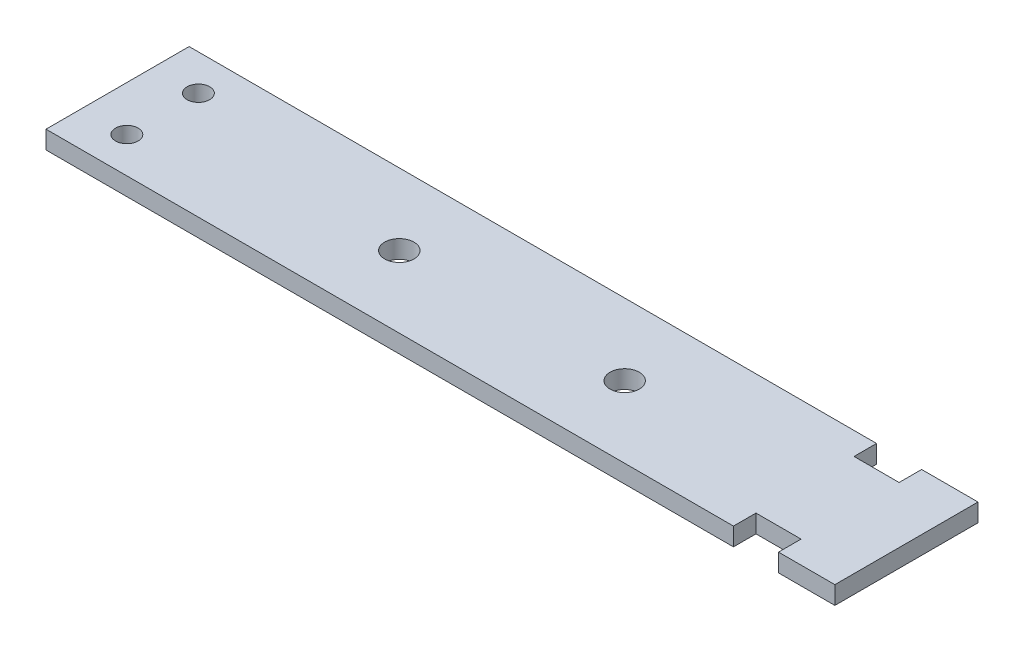
ISO-10303-21;
HEADER;
FILE_DESCRIPTION(('STEP AP214'),'2;1');
FILE_NAME('part.step','',(''),(''),'','','');
FILE_SCHEMA(('AUTOMOTIVE_DESIGN { 1 0 10303 214 1 1 1 1 }'));
ENDSEC;
DATA;
#1=APPLICATION_CONTEXT('core data for automotive mechanical design processes');
#2=APPLICATION_PROTOCOL_DEFINITION('international standard','automotive_design',2000,#1);
#3=PRODUCT_CONTEXT('',#1,'mechanical');
#4=PRODUCT('Part','Part','',(#3));
#5=PRODUCT_RELATED_PRODUCT_CATEGORY('part','',(#4));
#6=PRODUCT_DEFINITION_FORMATION('','',#4);
#7=PRODUCT_DEFINITION_CONTEXT('part definition',#1,'design');
#8=PRODUCT_DEFINITION('design','',#6,#7);
#9=PRODUCT_DEFINITION_SHAPE('','',#8);
#10=(LENGTH_UNIT() NAMED_UNIT(*) SI_UNIT(.MILLI.,.METRE.));
#11=(NAMED_UNIT(*) PLANE_ANGLE_UNIT() SI_UNIT($,.RADIAN.));
#12=(NAMED_UNIT(*) SI_UNIT($,.STERADIAN.) SOLID_ANGLE_UNIT());
#13=UNCERTAINTY_MEASURE_WITH_UNIT(LENGTH_MEASURE(1.E-05),#10,'distance_accuracy_value','');
#14=(GEOMETRIC_REPRESENTATION_CONTEXT(3) GLOBAL_UNCERTAINTY_ASSIGNED_CONTEXT((#13)) GLOBAL_UNIT_ASSIGNED_CONTEXT((#10,
#11,#12)) REPRESENTATION_CONTEXT('',''));
#15=CARTESIAN_POINT('',(0.,0.,0.));
#16=DIRECTION('',(0.,0.,1.));
#17=DIRECTION('',(1.,0.,0.));
#18=AXIS2_PLACEMENT_3D('',#15,#16,#17);
#19=CARTESIAN_POINT('',(0.,1.6,0.));
#20=DIRECTION('',(0.,-1.,0.));
#21=DIRECTION('',(0.,0.,-1.));
#22=AXIS2_PLACEMENT_3D('',#19,#20,#21);
#23=PLANE('',#22);
#24=DIRECTION('',(0.,0.,1.));
#25=VECTOR('',#24,1.);
#26=CARTESIAN_POINT('',(0.,1.6,0.));
#27=LINE('',#26,#25);
#28=CARTESIAN_POINT('',(0.,1.6,-12.7));
#29=VERTEX_POINT('',#28);
#30=CARTESIAN_POINT('',(0.,1.6,0.));
#31=VERTEX_POINT('',#30);
#32=EDGE_CURVE('E202',#29,#31,#27,.T.);
#33=ORIENTED_EDGE('',*,*,#32,.T.);
#34=DIRECTION('',(1.,0.,0.));
#35=VECTOR('',#34,1.);
#36=CARTESIAN_POINT('',(0.,1.6,0.));
#37=LINE('',#36,#35);
#38=CARTESIAN_POINT('',(61.,1.6,0.));
#39=VERTEX_POINT('',#38);
#40=EDGE_CURVE('E114',#31,#39,#37,.T.);
#41=ORIENTED_EDGE('',*,*,#40,.T.);
#42=DIRECTION('',(0.,0.,-1.));
#43=VECTOR('',#42,1.);
#44=CARTESIAN_POINT('',(61.,1.6,0.));
#45=LINE('',#44,#43);
#46=CARTESIAN_POINT('',(61.,1.6,-2.));
#47=VERTEX_POINT('',#46);
#48=EDGE_CURVE('E239',#39,#47,#45,.T.);
#49=ORIENTED_EDGE('',*,*,#48,.T.);
#50=DIRECTION('',(1.,0.,0.));
#51=VECTOR('',#50,1.);
#52=CARTESIAN_POINT('',(61.,1.6,-2.));
#53=LINE('',#52,#51);
#54=CARTESIAN_POINT('',(65.,1.6,-2.));
#55=VERTEX_POINT('',#54);
#56=EDGE_CURVE('E259',#47,#55,#53,.T.);
#57=ORIENTED_EDGE('',*,*,#56,.T.);
#58=DIRECTION('',(0.,0.,1.));
#59=VECTOR('',#58,1.);
#60=CARTESIAN_POINT('',(65.,1.6,-2.));
#61=LINE('',#60,#59);
#62=CARTESIAN_POINT('',(65.,1.6,0.));
#63=VERTEX_POINT('',#62);
#64=EDGE_CURVE('E255',#55,#63,#61,.T.);
#65=ORIENTED_EDGE('',*,*,#64,.T.);
#66=DIRECTION('',(1.,0.,0.));
#67=VECTOR('',#66,1.);
#68=CARTESIAN_POINT('',(65.,1.6,0.));
#69=LINE('',#68,#67);
#70=CARTESIAN_POINT('',(70.,1.6,0.));
#71=VERTEX_POINT('',#70);
#72=EDGE_CURVE('E258',#63,#71,#69,.T.);
#73=ORIENTED_EDGE('',*,*,#72,.T.);
#74=DIRECTION('',(0.,0.,-1.));
#75=VECTOR('',#74,1.);
#76=CARTESIAN_POINT('',(70.,1.6,0.));
#77=LINE('',#76,#75);
#78=CARTESIAN_POINT('',(70.,1.6,-12.7));
#79=VERTEX_POINT('',#78);
#80=EDGE_CURVE('E263',#71,#79,#77,.T.);
#81=ORIENTED_EDGE('',*,*,#80,.T.);
#82=DIRECTION('',(-1.,0.,0.));
#83=VECTOR('',#82,1.);
#84=CARTESIAN_POINT('',(65.,1.6,-12.7));
#85=LINE('',#84,#83);
#86=CARTESIAN_POINT('',(65.,1.6,-12.7));
#87=VERTEX_POINT('',#86);
#88=EDGE_CURVE('E270',#79,#87,#85,.T.);
#89=ORIENTED_EDGE('',*,*,#88,.T.);
#90=DIRECTION('',(0.,0.,1.));
#91=VECTOR('',#90,1.);
#92=CARTESIAN_POINT('',(65.,1.6,-12.7));
#93=LINE('',#92,#91);
#94=CARTESIAN_POINT('',(65.,1.6,-10.7));
#95=VERTEX_POINT('',#94);
#96=EDGE_CURVE('E145',#87,#95,#93,.T.);
#97=ORIENTED_EDGE('',*,*,#96,.T.);
#98=DIRECTION('',(-1.,0.,0.));
#99=VECTOR('',#98,1.);
#100=CARTESIAN_POINT('',(65.,1.6,-10.7));
#101=LINE('',#100,#99);
#102=CARTESIAN_POINT('',(61.,1.6,-10.7));
#103=VERTEX_POINT('',#102);
#104=EDGE_CURVE('E139',#95,#103,#101,.T.);
#105=ORIENTED_EDGE('',*,*,#104,.T.);
#106=DIRECTION('',(0.,0.,-1.));
#107=VECTOR('',#106,1.);
#108=CARTESIAN_POINT('',(61.,1.6,-10.7));
#109=LINE('',#108,#107);
#110=CARTESIAN_POINT('',(61.,1.6,-12.7));
#111=VERTEX_POINT('',#110);
#112=EDGE_CURVE('E143',#103,#111,#109,.T.);
#113=ORIENTED_EDGE('',*,*,#112,.T.);
#114=DIRECTION('',(-1.,0.,0.));
#115=VECTOR('',#114,1.);
#116=CARTESIAN_POINT('',(0.,1.6,-12.7));
#117=LINE('',#116,#115);
#118=EDGE_CURVE('E59',#111,#29,#117,.T.);
#119=ORIENTED_EDGE('',*,*,#118,.T.);
#120=EDGE_LOOP('',(#33,#41,#49,#57,#65,#73,#81,#89,#97,#105,#113,#119));
#121=FACE_BOUND('',#120,.T.);
#122=CARTESIAN_POINT('',(4.,1.6,-9.525));
#123=DIRECTION('',(0.,1.,0.));
#124=DIRECTION('',(0.,0.,1.));
#125=AXIS2_PLACEMENT_3D('',#122,#123,#124);
#126=CIRCLE('',#125,1.);
#127=CARTESIAN_POINT('',(4.,1.6,-8.525));
#128=VERTEX_POINT('',#127);
#129=EDGE_CURVE('E172',#128,#128,#126,.T.);
#130=ORIENTED_EDGE('',*,*,#129,.F.);
#131=EDGE_LOOP('',(#130));
#132=FACE_BOUND('',#131,.T.);
#133=CARTESIAN_POINT('',(4.,1.6,-3.175));
#134=DIRECTION('',(0.,1.,0.));
#135=DIRECTION('',(0.,0.,1.));
#136=AXIS2_PLACEMENT_3D('',#133,#134,#135);
#137=CIRCLE('',#136,1.);
#138=CARTESIAN_POINT('',(4.,1.6,-2.175));
#139=VERTEX_POINT('',#138);
#140=EDGE_CURVE('E340',#139,#139,#137,.T.);
#141=ORIENTED_EDGE('',*,*,#140,.F.);
#142=EDGE_LOOP('',(#141));
#143=FACE_BOUND('',#142,.T.);
#144=CARTESIAN_POINT('',(25.,1.6,-6.35));
#145=DIRECTION('',(0.,1.,0.));
#146=DIRECTION('',(0.,0.,1.));
#147=AXIS2_PLACEMENT_3D('',#144,#145,#146);
#148=CIRCLE('',#147,1.3);
#149=CARTESIAN_POINT('',(25.,1.6,-5.05000000000001));
#150=VERTEX_POINT('',#149);
#151=EDGE_CURVE('E332',#150,#150,#148,.T.);
#152=ORIENTED_EDGE('',*,*,#151,.F.);
#153=EDGE_LOOP('',(#152));
#154=FACE_BOUND('',#153,.T.);
#155=CARTESIAN_POINT('',(45.,1.6,-6.35000000000001));
#156=DIRECTION('',(0.,1.,0.));
#157=DIRECTION('',(0.,0.,-1.));
#158=AXIS2_PLACEMENT_3D('',#155,#156,#157);
#159=CIRCLE('',#158,1.3);
#160=CARTESIAN_POINT('',(45.,1.6,-7.65000000000001));
#161=VERTEX_POINT('',#160);
#162=EDGE_CURVE('E321',#161,#161,#159,.T.);
#163=ORIENTED_EDGE('',*,*,#162,.F.);
#164=EDGE_LOOP('',(#163));
#165=FACE_BOUND('',#164,.T.);
#166=ADVANCED_FACE('F41',(#121,#132,#143,#154,#165),#23,.F.);
#167=CARTESIAN_POINT('',(0.,0.,0.));
#168=DIRECTION('',(0.,-1.,0.));
#169=DIRECTION('',(0.,0.,-1.));
#170=AXIS2_PLACEMENT_3D('',#167,#168,#169);
#171=PLANE('',#170);
#172=CARTESIAN_POINT('',(25.,0.,-6.35));
#173=DIRECTION('',(0.,1.,0.));
#174=DIRECTION('',(0.,0.,1.));
#175=AXIS2_PLACEMENT_3D('',#172,#173,#174);
#176=CIRCLE('',#175,1.3);
#177=CARTESIAN_POINT('',(25.,0.,-5.05000000000001));
#178=VERTEX_POINT('',#177);
#179=EDGE_CURVE('E329',#178,#178,#176,.T.);
#180=ORIENTED_EDGE('',*,*,#179,.T.);
#181=EDGE_LOOP('',(#180));
#182=FACE_BOUND('',#181,.T.);
#183=CARTESIAN_POINT('',(4.,0.,-9.525));
#184=DIRECTION('',(0.,1.,0.));
#185=DIRECTION('',(0.,0.,1.));
#186=AXIS2_PLACEMENT_3D('',#183,#184,#185);
#187=CIRCLE('',#186,1.);
#188=CARTESIAN_POINT('',(4.,0.,-8.525));
#189=VERTEX_POINT('',#188);
#190=EDGE_CURVE('E344',#189,#189,#187,.T.);
#191=ORIENTED_EDGE('',*,*,#190,.T.);
#192=EDGE_LOOP('',(#191));
#193=FACE_BOUND('',#192,.T.);
#194=DIRECTION('',(0.,0.,1.));
#195=VECTOR('',#194,1.);
#196=CARTESIAN_POINT('',(0.,0.,0.));
#197=LINE('',#196,#195);
#198=CARTESIAN_POINT('',(0.,0.,-12.7));
#199=VERTEX_POINT('',#198);
#200=CARTESIAN_POINT('',(0.,0.,0.));
#201=VERTEX_POINT('',#200);
#202=EDGE_CURVE('E167',#199,#201,#197,.T.);
#203=ORIENTED_EDGE('',*,*,#202,.F.);
#204=DIRECTION('',(-1.,0.,0.));
#205=VECTOR('',#204,1.);
#206=CARTESIAN_POINT('',(0.,0.,-12.7));
#207=LINE('',#206,#205);
#208=CARTESIAN_POINT('',(61.,0.,-12.7));
#209=VERTEX_POINT('',#208);
#210=EDGE_CURVE('E106',#209,#199,#207,.T.);
#211=ORIENTED_EDGE('',*,*,#210,.F.);
#212=DIRECTION('',(0.,0.,-1.));
#213=VECTOR('',#212,1.);
#214=CARTESIAN_POINT('',(61.,0.,-10.7));
#215=LINE('',#214,#213);
#216=CARTESIAN_POINT('',(61.,0.,-10.7));
#217=VERTEX_POINT('',#216);
#218=EDGE_CURVE('E100',#217,#209,#215,.T.);
#219=ORIENTED_EDGE('',*,*,#218,.F.);
#220=DIRECTION('',(-1.,0.,0.));
#221=VECTOR('',#220,1.);
#222=CARTESIAN_POINT('',(65.,0.,-10.7));
#223=LINE('',#222,#221);
#224=CARTESIAN_POINT('',(65.,0.,-10.7));
#225=VERTEX_POINT('',#224);
#226=EDGE_CURVE('E154',#225,#217,#223,.T.);
#227=ORIENTED_EDGE('',*,*,#226,.F.);
#228=DIRECTION('',(0.,0.,1.));
#229=VECTOR('',#228,1.);
#230=CARTESIAN_POINT('',(65.,0.,-12.7));
#231=LINE('',#230,#229);
#232=CARTESIAN_POINT('',(65.,0.,-12.7));
#233=VERTEX_POINT('',#232);
#234=EDGE_CURVE('E193',#233,#225,#231,.T.);
#235=ORIENTED_EDGE('',*,*,#234,.F.);
#236=DIRECTION('',(-1.,0.,0.));
#237=VECTOR('',#236,1.);
#238=CARTESIAN_POINT('',(65.,0.,-12.7));
#239=LINE('',#238,#237);
#240=CARTESIAN_POINT('',(70.,0.,-12.7));
#241=VERTEX_POINT('',#240);
#242=EDGE_CURVE('E190',#241,#233,#239,.T.);
#243=ORIENTED_EDGE('',*,*,#242,.F.);
#244=DIRECTION('',(0.,0.,-1.));
#245=VECTOR('',#244,1.);
#246=CARTESIAN_POINT('',(70.,0.,0.));
#247=LINE('',#246,#245);
#248=CARTESIAN_POINT('',(70.,0.,0.));
#249=VERTEX_POINT('',#248);
#250=EDGE_CURVE('E187',#249,#241,#247,.T.);
#251=ORIENTED_EDGE('',*,*,#250,.F.);
#252=DIRECTION('',(1.,0.,0.));
#253=VECTOR('',#252,1.);
#254=CARTESIAN_POINT('',(65.,0.,0.));
#255=LINE('',#254,#253);
#256=CARTESIAN_POINT('',(65.,0.,0.));
#257=VERTEX_POINT('',#256);
#258=EDGE_CURVE('E184',#257,#249,#255,.T.);
#259=ORIENTED_EDGE('',*,*,#258,.F.);
#260=DIRECTION('',(0.,0.,1.));
#261=VECTOR('',#260,1.);
#262=CARTESIAN_POINT('',(65.,0.,-2.));
#263=LINE('',#262,#261);
#264=CARTESIAN_POINT('',(65.,0.,-2.));
#265=VERTEX_POINT('',#264);
#266=EDGE_CURVE('E181',#265,#257,#263,.T.);
#267=ORIENTED_EDGE('',*,*,#266,.F.);
#268=DIRECTION('',(1.,0.,0.));
#269=VECTOR('',#268,1.);
#270=CARTESIAN_POINT('',(61.,0.,-2.));
#271=LINE('',#270,#269);
#272=CARTESIAN_POINT('',(61.,0.,-2.));
#273=VERTEX_POINT('',#272);
#274=EDGE_CURVE('E178',#273,#265,#271,.T.);
#275=ORIENTED_EDGE('',*,*,#274,.F.);
#276=DIRECTION('',(0.,0.,-1.));
#277=VECTOR('',#276,1.);
#278=CARTESIAN_POINT('',(61.,0.,0.));
#279=LINE('',#278,#277);
#280=CARTESIAN_POINT('',(61.,0.,0.));
#281=VERTEX_POINT('',#280);
#282=EDGE_CURVE('E175',#281,#273,#279,.T.);
#283=ORIENTED_EDGE('',*,*,#282,.F.);
#284=DIRECTION('',(1.,0.,0.));
#285=VECTOR('',#284,1.);
#286=CARTESIAN_POINT('',(0.,0.,0.));
#287=LINE('',#286,#285);
#288=EDGE_CURVE('E171',#201,#281,#287,.T.);
#289=ORIENTED_EDGE('',*,*,#288,.F.);
#290=EDGE_LOOP('',(#203,#211,#219,#227,#235,#243,#251,#259,#267,#275,#283,#289));
#291=FACE_BOUND('',#290,.T.);
#292=CARTESIAN_POINT('',(4.,0.,-3.175));
#293=DIRECTION('',(0.,1.,0.));
#294=DIRECTION('',(0.,0.,1.));
#295=AXIS2_PLACEMENT_3D('',#292,#293,#294);
#296=CIRCLE('',#295,1.);
#297=CARTESIAN_POINT('',(4.,0.,-2.175));
#298=VERTEX_POINT('',#297);
#299=EDGE_CURVE('E336',#298,#298,#296,.T.);
#300=ORIENTED_EDGE('',*,*,#299,.T.);
#301=EDGE_LOOP('',(#300));
#302=FACE_BOUND('',#301,.T.);
#303=CARTESIAN_POINT('',(45.,0.,-6.35000000000001));
#304=DIRECTION('',(0.,1.,0.));
#305=DIRECTION('',(0.,0.,-1.));
#306=AXIS2_PLACEMENT_3D('',#303,#304,#305);
#307=CIRCLE('',#306,1.3);
#308=CARTESIAN_POINT('',(45.,0.,-7.65000000000001));
#309=VERTEX_POINT('',#308);
#310=EDGE_CURVE('E324',#309,#309,#307,.T.);
#311=ORIENTED_EDGE('',*,*,#310,.T.);
#312=EDGE_LOOP('',(#311));
#313=FACE_BOUND('',#312,.T.);
#314=ADVANCED_FACE('F243',(#182,#193,#291,#302,#313),#171,.T.);
#315=CARTESIAN_POINT('',(0.,1.6,0.));
#316=DIRECTION('',(1.,0.,0.));
#317=DIRECTION('',(0.,0.,-1.));
#318=AXIS2_PLACEMENT_3D('',#315,#316,#317);
#319=PLANE('',#318);
#320=ORIENTED_EDGE('',*,*,#202,.T.);
#321=DIRECTION('',(0.,-1.,0.));
#322=VECTOR('',#321,1.);
#323=CARTESIAN_POINT('',(0.,1.6,0.));
#324=LINE('',#323,#322);
#325=EDGE_CURVE('E11',#31,#201,#324,.T.);
#326=ORIENTED_EDGE('',*,*,#325,.F.);
#327=ORIENTED_EDGE('',*,*,#32,.F.);
#328=DIRECTION('',(0.,-1.,0.));
#329=VECTOR('',#328,1.);
#330=CARTESIAN_POINT('',(0.,1.6,-12.7));
#331=LINE('',#330,#329);
#332=EDGE_CURVE('E163',#29,#199,#331,.T.);
#333=ORIENTED_EDGE('',*,*,#332,.T.);
#334=EDGE_LOOP('',(#320,#326,#327,#333));
#335=FACE_BOUND('',#334,.T.);
#336=ADVANCED_FACE('F43',(#335),#319,.F.);
#337=CARTESIAN_POINT('',(0.,1.6,0.));
#338=DIRECTION('',(0.,0.,-1.));
#339=DIRECTION('',(-1.,0.,0.));
#340=AXIS2_PLACEMENT_3D('',#337,#338,#339);
#341=PLANE('',#340);
#342=ORIENTED_EDGE('',*,*,#288,.T.);
#343=DIRECTION('',(0.,-1.,0.));
#344=VECTOR('',#343,1.);
#345=CARTESIAN_POINT('',(61.,1.6,0.));
#346=LINE('',#345,#344);
#347=EDGE_CURVE('E51',#39,#281,#346,.T.);
#348=ORIENTED_EDGE('',*,*,#347,.F.);
#349=ORIENTED_EDGE('',*,*,#40,.F.);
#350=ORIENTED_EDGE('',*,*,#325,.T.);
#351=EDGE_LOOP('',(#342,#348,#349,#350));
#352=FACE_BOUND('',#351,.T.);
#353=ADVANCED_FACE('F462',(#352),#341,.F.);
#354=CARTESIAN_POINT('',(61.,1.6,0.));
#355=DIRECTION('',(-1.,0.,0.));
#356=DIRECTION('',(0.,0.,1.));
#357=AXIS2_PLACEMENT_3D('',#354,#355,#356);
#358=PLANE('',#357);
#359=ORIENTED_EDGE('',*,*,#282,.T.);
#360=DIRECTION('',(0.,-1.,0.));
#361=VECTOR('',#360,1.);
#362=CARTESIAN_POINT('',(61.,1.6,-2.));
#363=LINE('',#362,#361);
#364=EDGE_CURVE('E229',#47,#273,#363,.T.);
#365=ORIENTED_EDGE('',*,*,#364,.F.);
#366=ORIENTED_EDGE('',*,*,#48,.F.);
#367=ORIENTED_EDGE('',*,*,#347,.T.);
#368=EDGE_LOOP('',(#359,#365,#366,#367));
#369=FACE_BOUND('',#368,.T.);
#370=ADVANCED_FACE('F237',(#369),#358,.F.);
#371=CARTESIAN_POINT('',(61.,1.6,-2.));
#372=DIRECTION('',(0.,0.,-1.));
#373=DIRECTION('',(-1.,0.,0.));
#374=AXIS2_PLACEMENT_3D('',#371,#372,#373);
#375=PLANE('',#374);
#376=ORIENTED_EDGE('',*,*,#274,.T.);
#377=DIRECTION('',(0.,-1.,0.));
#378=VECTOR('',#377,1.);
#379=CARTESIAN_POINT('',(65.,1.6,-2.));
#380=LINE('',#379,#378);
#381=EDGE_CURVE('E225',#55,#265,#380,.T.);
#382=ORIENTED_EDGE('',*,*,#381,.F.);
#383=ORIENTED_EDGE('',*,*,#56,.F.);
#384=ORIENTED_EDGE('',*,*,#364,.T.);
#385=EDGE_LOOP('',(#376,#382,#383,#384));
#386=FACE_BOUND('',#385,.T.);
#387=ADVANCED_FACE('F249',(#386),#375,.F.);
#388=CARTESIAN_POINT('',(65.,1.6,-2.));
#389=DIRECTION('',(1.,0.,0.));
#390=DIRECTION('',(0.,0.,-1.));
#391=AXIS2_PLACEMENT_3D('',#388,#389,#390);
#392=PLANE('',#391);
#393=ORIENTED_EDGE('',*,*,#266,.T.);
#394=DIRECTION('',(0.,-1.,0.));
#395=VECTOR('',#394,1.);
#396=CARTESIAN_POINT('',(65.,1.6,0.));
#397=LINE('',#396,#395);
#398=EDGE_CURVE('E221',#63,#257,#397,.T.);
#399=ORIENTED_EDGE('',*,*,#398,.F.);
#400=ORIENTED_EDGE('',*,*,#64,.F.);
#401=ORIENTED_EDGE('',*,*,#381,.T.);
#402=EDGE_LOOP('',(#393,#399,#400,#401));
#403=FACE_BOUND('',#402,.T.);
#404=ADVANCED_FACE('F253',(#403),#392,.F.);
#405=CARTESIAN_POINT('',(65.,1.6,0.));
#406=DIRECTION('',(0.,0.,-1.));
#407=DIRECTION('',(-1.,0.,0.));
#408=AXIS2_PLACEMENT_3D('',#405,#406,#407);
#409=PLANE('',#408);
#410=ORIENTED_EDGE('',*,*,#258,.T.);
#411=DIRECTION('',(0.,-1.,0.));
#412=VECTOR('',#411,1.);
#413=CARTESIAN_POINT('',(70.,1.6,0.));
#414=LINE('',#413,#412);
#415=EDGE_CURVE('E217',#71,#249,#414,.T.);
#416=ORIENTED_EDGE('',*,*,#415,.F.);
#417=ORIENTED_EDGE('',*,*,#72,.F.);
#418=ORIENTED_EDGE('',*,*,#398,.T.);
#419=EDGE_LOOP('',(#410,#416,#417,#418));
#420=FACE_BOUND('',#419,.T.);
#421=ADVANCED_FACE('F427',(#420),#409,.F.);
#422=CARTESIAN_POINT('',(70.,1.6,0.));
#423=DIRECTION('',(-1.,0.,0.));
#424=DIRECTION('',(0.,0.,1.));
#425=AXIS2_PLACEMENT_3D('',#422,#423,#424);
#426=PLANE('',#425);
#427=ORIENTED_EDGE('',*,*,#250,.T.);
#428=DIRECTION('',(0.,-1.,0.));
#429=VECTOR('',#428,1.);
#430=CARTESIAN_POINT('',(70.,1.6,-12.7));
#431=LINE('',#430,#429);
#432=EDGE_CURVE('E213',#79,#241,#431,.T.);
#433=ORIENTED_EDGE('',*,*,#432,.F.);
#434=ORIENTED_EDGE('',*,*,#80,.F.);
#435=ORIENTED_EDGE('',*,*,#415,.T.);
#436=EDGE_LOOP('',(#427,#433,#434,#435));
#437=FACE_BOUND('',#436,.T.);
#438=ADVANCED_FACE('F418',(#437),#426,.F.);
#439=CARTESIAN_POINT('',(65.,1.6,-12.7));
#440=DIRECTION('',(0.,0.,1.));
#441=DIRECTION('',(1.,0.,0.));
#442=AXIS2_PLACEMENT_3D('',#439,#440,#441);
#443=PLANE('',#442);
#444=ORIENTED_EDGE('',*,*,#242,.T.);
#445=DIRECTION('',(0.,-1.,0.));
#446=VECTOR('',#445,1.);
#447=CARTESIAN_POINT('',(65.,1.6,-12.7));
#448=LINE('',#447,#446);
#449=EDGE_CURVE('E209',#87,#233,#448,.T.);
#450=ORIENTED_EDGE('',*,*,#449,.F.);
#451=ORIENTED_EDGE('',*,*,#88,.F.);
#452=ORIENTED_EDGE('',*,*,#432,.T.);
#453=EDGE_LOOP('',(#444,#450,#451,#452));
#454=FACE_BOUND('',#453,.T.);
#455=ADVANCED_FACE('F278',(#454),#443,.F.);
#456=CARTESIAN_POINT('',(65.,1.6,-12.7));
#457=DIRECTION('',(1.,0.,0.));
#458=DIRECTION('',(0.,0.,-1.));
#459=AXIS2_PLACEMENT_3D('',#456,#457,#458);
#460=PLANE('',#459);
#461=ORIENTED_EDGE('',*,*,#234,.T.);
#462=DIRECTION('',(0.,-1.,0.));
#463=VECTOR('',#462,1.);
#464=CARTESIAN_POINT('',(65.,1.6,-10.7));
#465=LINE('',#464,#463);
#466=EDGE_CURVE('E156',#95,#225,#465,.T.);
#467=ORIENTED_EDGE('',*,*,#466,.F.);
#468=ORIENTED_EDGE('',*,*,#96,.F.);
#469=ORIENTED_EDGE('',*,*,#449,.T.);
#470=EDGE_LOOP('',(#461,#467,#468,#469));
#471=FACE_BOUND('',#470,.T.);
#472=ADVANCED_FACE('F282',(#471),#460,.F.);
#473=CARTESIAN_POINT('',(65.,1.6,-10.7));
#474=DIRECTION('',(0.,0.,1.));
#475=DIRECTION('',(1.,0.,0.));
#476=AXIS2_PLACEMENT_3D('',#473,#474,#475);
#477=PLANE('',#476);
#478=ORIENTED_EDGE('',*,*,#226,.T.);
#479=DIRECTION('',(0.,-1.,0.));
#480=VECTOR('',#479,1.);
#481=CARTESIAN_POINT('',(61.,1.6,-10.7));
#482=LINE('',#481,#480);
#483=EDGE_CURVE('E151',#103,#217,#482,.T.);
#484=ORIENTED_EDGE('',*,*,#483,.F.);
#485=ORIENTED_EDGE('',*,*,#104,.F.);
#486=ORIENTED_EDGE('',*,*,#466,.T.);
#487=EDGE_LOOP('',(#478,#484,#485,#486));
#488=FACE_BOUND('',#487,.T.);
#489=ADVANCED_FACE('F152',(#488),#477,.F.);
#490=CARTESIAN_POINT('',(61.,1.6,-10.7));
#491=DIRECTION('',(-1.,0.,0.));
#492=DIRECTION('',(0.,0.,1.));
#493=AXIS2_PLACEMENT_3D('',#490,#491,#492);
#494=PLANE('',#493);
#495=ORIENTED_EDGE('',*,*,#218,.T.);
#496=DIRECTION('',(0.,-1.,0.));
#497=VECTOR('',#496,1.);
#498=CARTESIAN_POINT('',(61.,1.6,-12.7));
#499=LINE('',#498,#497);
#500=EDGE_CURVE('E157',#111,#209,#499,.T.);
#501=ORIENTED_EDGE('',*,*,#500,.F.);
#502=ORIENTED_EDGE('',*,*,#112,.F.);
#503=ORIENTED_EDGE('',*,*,#483,.T.);
#504=EDGE_LOOP('',(#495,#501,#502,#503));
#505=FACE_BOUND('',#504,.T.);
#506=ADVANCED_FACE('F159',(#505),#494,.F.);
#507=CARTESIAN_POINT('',(0.,1.6,-12.7));
#508=DIRECTION('',(0.,0.,1.));
#509=DIRECTION('',(1.,0.,0.));
#510=AXIS2_PLACEMENT_3D('',#507,#508,#509);
#511=PLANE('',#510);
#512=ORIENTED_EDGE('',*,*,#210,.T.);
#513=ORIENTED_EDGE('',*,*,#332,.F.);
#514=ORIENTED_EDGE('',*,*,#118,.F.);
#515=ORIENTED_EDGE('',*,*,#500,.T.);
#516=EDGE_LOOP('',(#512,#513,#514,#515));
#517=FACE_BOUND('',#516,.T.);
#518=ADVANCED_FACE('F286',(#517),#511,.F.);
#519=CARTESIAN_POINT('',(4.,1.6,-9.525));
#520=DIRECTION('',(0.,-1.,0.));
#521=DIRECTION('',(0.,0.,-1.));
#522=AXIS2_PLACEMENT_3D('',#519,#520,#521);
#523=CYLINDRICAL_SURFACE('',#522,1.);
#524=ORIENTED_EDGE('',*,*,#129,.T.);
#525=EDGE_LOOP('',(#524));
#526=FACE_BOUND('',#525,.T.);
#527=ORIENTED_EDGE('',*,*,#190,.F.);
#528=EDGE_LOOP('',(#527));
#529=FACE_BOUND('',#528,.T.);
#530=ADVANCED_FACE('F288',(#526,#529),#523,.F.);
#531=CARTESIAN_POINT('',(4.,1.6,-3.175));
#532=DIRECTION('',(0.,-1.,0.));
#533=DIRECTION('',(0.,0.,-1.));
#534=AXIS2_PLACEMENT_3D('',#531,#532,#533);
#535=CYLINDRICAL_SURFACE('',#534,1.);
#536=ORIENTED_EDGE('',*,*,#140,.T.);
#537=EDGE_LOOP('',(#536));
#538=FACE_BOUND('',#537,.T.);
#539=ORIENTED_EDGE('',*,*,#299,.F.);
#540=EDGE_LOOP('',(#539));
#541=FACE_BOUND('',#540,.T.);
#542=ADVANCED_FACE('F294',(#538,#541),#535,.F.);
#543=CARTESIAN_POINT('',(25.,1.6,-6.35));
#544=DIRECTION('',(0.,-1.,0.));
#545=DIRECTION('',(0.,0.,-1.));
#546=AXIS2_PLACEMENT_3D('',#543,#544,#545);
#547=CYLINDRICAL_SURFACE('',#546,1.3);
#548=ORIENTED_EDGE('',*,*,#151,.T.);
#549=EDGE_LOOP('',(#548));
#550=FACE_BOUND('',#549,.T.);
#551=ORIENTED_EDGE('',*,*,#179,.F.);
#552=EDGE_LOOP('',(#551));
#553=FACE_BOUND('',#552,.T.);
#554=ADVANCED_FACE('F308',(#550,#553),#547,.F.);
#555=CARTESIAN_POINT('',(45.,1.6,-6.35000000000001));
#556=DIRECTION('',(0.,-1.,0.));
#557=DIRECTION('',(0.,0.,-1.));
#558=AXIS2_PLACEMENT_3D('',#555,#556,#557);
#559=CYLINDRICAL_SURFACE('',#558,1.3);
#560=ORIENTED_EDGE('',*,*,#162,.T.);
#561=EDGE_LOOP('',(#560));
#562=FACE_BOUND('',#561,.T.);
#563=ORIENTED_EDGE('',*,*,#310,.F.);
#564=EDGE_LOOP('',(#563));
#565=FACE_BOUND('',#564,.T.);
#566=ADVANCED_FACE('F312',(#562,#565),#559,.F.);
#567=CLOSED_SHELL('',(#166,#314,#336,#353,#370,#387,#404,#421,#438,#455,#472,#489,#506,#518,
#530,#542,#554,#566));
#568=MANIFOLD_SOLID_BREP('B2',#567);
#569=ADVANCED_BREP_SHAPE_REPRESENTATION('',(#18,#568),#14);
#570=SHAPE_DEFINITION_REPRESENTATION(#9,#569);
ENDSEC;
END-ISO-10303-21;
